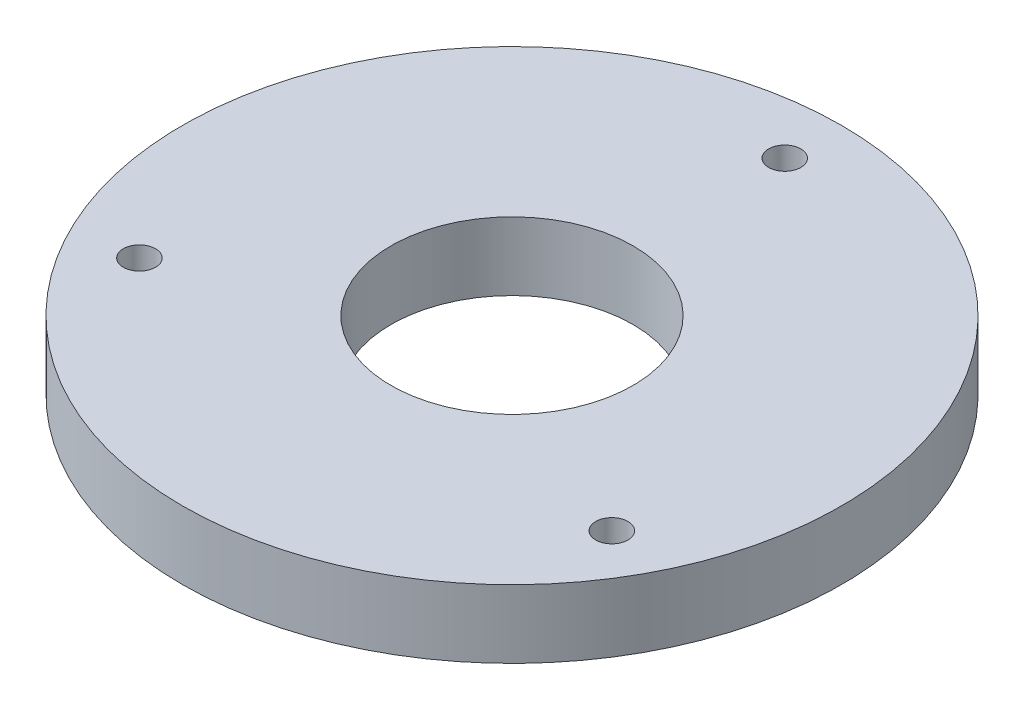
ISO-10303-21;
HEADER;
FILE_DESCRIPTION(('STEP AP214'),'2;1');
FILE_NAME('part.step','',(''),(''),'','','');
FILE_SCHEMA(('AUTOMOTIVE_DESIGN { 1 0 10303 214 1 1 1 1 }'));
ENDSEC;
DATA;
#1=APPLICATION_CONTEXT('core data for automotive mechanical design processes');
#2=APPLICATION_PROTOCOL_DEFINITION('international standard','automotive_design',2000,#1);
#3=PRODUCT_CONTEXT('',#1,'mechanical');
#4=PRODUCT('Part','Part','',(#3));
#5=PRODUCT_RELATED_PRODUCT_CATEGORY('part','',(#4));
#6=PRODUCT_DEFINITION_FORMATION('','',#4);
#7=PRODUCT_DEFINITION_CONTEXT('part definition',#1,'design');
#8=PRODUCT_DEFINITION('design','',#6,#7);
#9=PRODUCT_DEFINITION_SHAPE('','',#8);
#10=(LENGTH_UNIT() NAMED_UNIT(*) SI_UNIT(.MILLI.,.METRE.));
#11=(NAMED_UNIT(*) PLANE_ANGLE_UNIT() SI_UNIT($,.RADIAN.));
#12=(NAMED_UNIT(*) SI_UNIT($,.STERADIAN.) SOLID_ANGLE_UNIT());
#13=UNCERTAINTY_MEASURE_WITH_UNIT(LENGTH_MEASURE(1.E-05),#10,'distance_accuracy_value','');
#14=(GEOMETRIC_REPRESENTATION_CONTEXT(3) GLOBAL_UNCERTAINTY_ASSIGNED_CONTEXT((#13)) GLOBAL_UNIT_ASSIGNED_CONTEXT((#10,
#11,#12)) REPRESENTATION_CONTEXT('',''));
#15=CARTESIAN_POINT('',(0.,0.,0.));
#16=DIRECTION('',(0.,0.,1.));
#17=DIRECTION('',(1.,0.,0.));
#18=AXIS2_PLACEMENT_3D('',#15,#16,#17);
#19=CARTESIAN_POINT('',(0.,7.62,0.));
#20=DIRECTION('',(0.,1.,0.));
#21=DIRECTION('',(0.,0.,1.));
#22=AXIS2_PLACEMENT_3D('',#19,#20,#21);
#23=PLANE('',#22);
#24=CARTESIAN_POINT('',(0.,7.62,-30.48));
#25=DIRECTION('',(0.,1.,0.));
#26=DIRECTION('',(0.,0.,1.));
#27=AXIS2_PLACEMENT_3D('',#24,#25,#26);
#28=CIRCLE('',#27,1.8);
#29=CARTESIAN_POINT('',(0.,7.62,-28.68));
#30=VERTEX_POINT('',#29);
#31=EDGE_CURVE('E66',#30,#30,#28,.T.);
#32=ORIENTED_EDGE('',*,*,#31,.F.);
#33=EDGE_LOOP('',(#32));
#34=FACE_BOUND('',#33,.T.);
#35=CARTESIAN_POINT('',(26.3964543073516,7.62,15.2399999999989));
#36=DIRECTION('',(0.,1.,0.));
#37=DIRECTION('',(0.,0.,1.));
#38=AXIS2_PLACEMENT_3D('',#35,#36,#37);
#39=CIRCLE('',#38,1.8);
#40=CARTESIAN_POINT('',(26.3964543073516,7.62,17.0399999999989));
#41=VERTEX_POINT('',#40);
#42=EDGE_CURVE('E60',#41,#41,#39,.T.);
#43=ORIENTED_EDGE('',*,*,#42,.F.);
#44=EDGE_LOOP('',(#43));
#45=FACE_BOUND('',#44,.T.);
#46=CARTESIAN_POINT('',(-26.3964543073477,7.62,15.2400000000011));
#47=DIRECTION('',(0.,1.,0.));
#48=DIRECTION('',(0.,0.,1.));
#49=AXIS2_PLACEMENT_3D('',#46,#47,#48);
#50=CIRCLE('',#49,1.8);
#51=CARTESIAN_POINT('',(-26.3964543073477,7.62,17.0400000000011));
#52=VERTEX_POINT('',#51);
#53=EDGE_CURVE('E54',#52,#52,#50,.T.);
#54=ORIENTED_EDGE('',*,*,#53,.F.);
#55=EDGE_LOOP('',(#54));
#56=FACE_BOUND('',#55,.T.);
#57=CARTESIAN_POINT('',(0.,7.62,0.));
#58=DIRECTION('',(0.,1.,0.));
#59=DIRECTION('',(0.,0.,1.));
#60=AXIS2_PLACEMENT_3D('',#57,#58,#59);
#61=CIRCLE('',#60,36.83);
#62=CARTESIAN_POINT('',(0.,7.62,-36.83));
#63=VERTEX_POINT('',#62);
#64=EDGE_CURVE('E10',#63,#63,#61,.T.);
#65=ORIENTED_EDGE('',*,*,#64,.T.);
#66=EDGE_LOOP('',(#65));
#67=FACE_BOUND('',#66,.T.);
#68=CARTESIAN_POINT('',(0.,7.62,0.));
#69=DIRECTION('',(0.,1.,0.));
#70=DIRECTION('',(0.,0.,1.));
#71=AXIS2_PLACEMENT_3D('',#68,#69,#70);
#72=CIRCLE('',#71,13.5255);
#73=CARTESIAN_POINT('',(0.,7.62,-13.5255));
#74=VERTEX_POINT('',#73);
#75=EDGE_CURVE('E44',#74,#74,#72,.T.);
#76=ORIENTED_EDGE('',*,*,#75,.F.);
#77=EDGE_LOOP('',(#76));
#78=FACE_BOUND('',#77,.T.);
#79=ADVANCED_FACE('F33',(#34,#45,#56,#67,#78),#23,.T.);
#80=CARTESIAN_POINT('',(0.,0.,0.));
#81=DIRECTION('',(0.,1.,0.));
#82=DIRECTION('',(0.,0.,1.));
#83=AXIS2_PLACEMENT_3D('',#80,#81,#82);
#84=PLANE('',#83);
#85=CARTESIAN_POINT('',(0.,0.,-30.48));
#86=DIRECTION('',(0.,1.,0.));
#87=DIRECTION('',(0.,0.,1.));
#88=AXIS2_PLACEMENT_3D('',#85,#86,#87);
#89=CIRCLE('',#88,1.8);
#90=CARTESIAN_POINT('',(0.,0.,-28.68));
#91=VERTEX_POINT('',#90);
#92=EDGE_CURVE('E63',#91,#91,#89,.T.);
#93=ORIENTED_EDGE('',*,*,#92,.T.);
#94=EDGE_LOOP('',(#93));
#95=FACE_BOUND('',#94,.T.);
#96=CARTESIAN_POINT('',(26.3964543073516,0.,15.2399999999989));
#97=DIRECTION('',(0.,1.,0.));
#98=DIRECTION('',(0.,0.,1.));
#99=AXIS2_PLACEMENT_3D('',#96,#97,#98);
#100=CIRCLE('',#99,1.8);
#101=CARTESIAN_POINT('',(26.3964543073516,0.,17.0399999999989));
#102=VERTEX_POINT('',#101);
#103=EDGE_CURVE('E57',#102,#102,#100,.T.);
#104=ORIENTED_EDGE('',*,*,#103,.T.);
#105=EDGE_LOOP('',(#104));
#106=FACE_BOUND('',#105,.T.);
#107=CARTESIAN_POINT('',(-26.3964543073477,0.,15.2400000000011));
#108=DIRECTION('',(0.,1.,0.));
#109=DIRECTION('',(0.,0.,1.));
#110=AXIS2_PLACEMENT_3D('',#107,#108,#109);
#111=CIRCLE('',#110,1.8);
#112=CARTESIAN_POINT('',(-26.3964543073477,0.,17.0400000000011));
#113=VERTEX_POINT('',#112);
#114=EDGE_CURVE('E49',#113,#113,#111,.T.);
#115=ORIENTED_EDGE('',*,*,#114,.T.);
#116=EDGE_LOOP('',(#115));
#117=FACE_BOUND('',#116,.T.);
#118=CARTESIAN_POINT('',(0.,0.,0.));
#119=DIRECTION('',(0.,1.,0.));
#120=DIRECTION('',(0.,0.,1.));
#121=AXIS2_PLACEMENT_3D('',#118,#119,#120);
#122=CIRCLE('',#121,36.83);
#123=CARTESIAN_POINT('',(0.,0.,-36.83));
#124=VERTEX_POINT('',#123);
#125=EDGE_CURVE('E37',#124,#124,#122,.T.);
#126=ORIENTED_EDGE('',*,*,#125,.F.);
#127=EDGE_LOOP('',(#126));
#128=FACE_BOUND('',#127,.T.);
#129=CARTESIAN_POINT('',(0.,0.,0.));
#130=DIRECTION('',(0.,1.,0.));
#131=DIRECTION('',(0.,0.,1.));
#132=AXIS2_PLACEMENT_3D('',#129,#130,#131);
#133=CIRCLE('',#132,13.5255);
#134=CARTESIAN_POINT('',(0.,0.,-13.5255));
#135=VERTEX_POINT('',#134);
#136=EDGE_CURVE('E46',#135,#135,#133,.T.);
#137=ORIENTED_EDGE('',*,*,#136,.T.);
#138=EDGE_LOOP('',(#137));
#139=FACE_BOUND('',#138,.T.);
#140=ADVANCED_FACE('F74',(#95,#106,#117,#128,#139),#84,.F.);
#141=CARTESIAN_POINT('',(0.,7.62,0.));
#142=DIRECTION('',(0.,-1.,0.));
#143=DIRECTION('',(0.,0.,-1.));
#144=AXIS2_PLACEMENT_3D('',#141,#142,#143);
#145=CYLINDRICAL_SURFACE('',#144,36.83);
#146=CARTESIAN_POINT('',(0.,7.62,-36.83));
#147=CARTESIAN_POINT('',(0.,7.540625,-36.83));
#148=CARTESIAN_POINT('',(0.,7.46125,-36.83));
#149=CARTESIAN_POINT('',(0.,7.3025,-36.83));
#150=CARTESIAN_POINT('',(0.,7.223125,-36.83));
#151=CARTESIAN_POINT('',(0.,7.064375,-36.83));
#152=CARTESIAN_POINT('',(0.,6.985,-36.83));
#153=CARTESIAN_POINT('',(0.,6.82625,-36.83));
#154=CARTESIAN_POINT('',(0.,6.746875,-36.83));
#155=CARTESIAN_POINT('',(0.,6.588125,-36.83));
#156=CARTESIAN_POINT('',(0.,6.50875,-36.83));
#157=CARTESIAN_POINT('',(0.,6.35,-36.83));
#158=CARTESIAN_POINT('',(0.,6.270625,-36.83));
#159=CARTESIAN_POINT('',(0.,6.111875,-36.83));
#160=CARTESIAN_POINT('',(0.,6.0325,-36.83));
#161=CARTESIAN_POINT('',(0.,5.87375,-36.83));
#162=CARTESIAN_POINT('',(0.,5.794375,-36.83));
#163=CARTESIAN_POINT('',(0.,5.635625,-36.83));
#164=CARTESIAN_POINT('',(0.,5.55625,-36.83));
#165=CARTESIAN_POINT('',(0.,5.3975,-36.83));
#166=CARTESIAN_POINT('',(0.,5.318125,-36.83));
#167=CARTESIAN_POINT('',(0.,5.159375,-36.83));
#168=CARTESIAN_POINT('',(0.,5.08,-36.83));
#169=CARTESIAN_POINT('',(0.,4.92125,-36.83));
#170=CARTESIAN_POINT('',(0.,4.841875,-36.83));
#171=CARTESIAN_POINT('',(0.,4.683125,-36.83));
#172=CARTESIAN_POINT('',(0.,4.60375,-36.83));
#173=CARTESIAN_POINT('',(0.,4.445,-36.83));
#174=CARTESIAN_POINT('',(0.,4.365625,-36.83));
#175=CARTESIAN_POINT('',(0.,4.206875,-36.83));
#176=CARTESIAN_POINT('',(0.,4.1275,-36.83));
#177=CARTESIAN_POINT('',(0.,3.96875,-36.83));
#178=CARTESIAN_POINT('',(0.,3.889375,-36.83));
#179=CARTESIAN_POINT('',(0.,3.730625,-36.83));
#180=CARTESIAN_POINT('',(0.,3.65125,-36.83));
#181=CARTESIAN_POINT('',(0.,3.4925,-36.83));
#182=CARTESIAN_POINT('',(0.,3.413125,-36.83));
#183=CARTESIAN_POINT('',(0.,3.254375,-36.83));
#184=CARTESIAN_POINT('',(0.,3.175,-36.83));
#185=CARTESIAN_POINT('',(0.,3.01625,-36.83));
#186=CARTESIAN_POINT('',(0.,2.936875,-36.83));
#187=CARTESIAN_POINT('',(0.,2.778125,-36.83));
#188=CARTESIAN_POINT('',(0.,2.69875,-36.83));
#189=CARTESIAN_POINT('',(0.,2.54,-36.83));
#190=CARTESIAN_POINT('',(0.,2.460625,-36.83));
#191=CARTESIAN_POINT('',(0.,2.301875,-36.83));
#192=CARTESIAN_POINT('',(0.,2.2225,-36.83));
#193=CARTESIAN_POINT('',(0.,2.06375,-36.83));
#194=CARTESIAN_POINT('',(0.,1.984375,-36.83));
#195=CARTESIAN_POINT('',(0.,1.825625,-36.83));
#196=CARTESIAN_POINT('',(0.,1.74625,-36.83));
#197=CARTESIAN_POINT('',(0.,1.5875,-36.83));
#198=CARTESIAN_POINT('',(0.,1.508125,-36.83));
#199=CARTESIAN_POINT('',(0.,1.349375,-36.83));
#200=CARTESIAN_POINT('',(0.,1.27,-36.83));
#201=CARTESIAN_POINT('',(0.,1.11125,-36.83));
#202=CARTESIAN_POINT('',(0.,1.031875,-36.83));
#203=CARTESIAN_POINT('',(0.,0.873125,-36.83));
#204=CARTESIAN_POINT('',(0.,0.79375,-36.83));
#205=CARTESIAN_POINT('',(0.,0.635,-36.83));
#206=CARTESIAN_POINT('',(0.,0.555625,-36.83));
#207=CARTESIAN_POINT('',(0.,0.396875,-36.83));
#208=CARTESIAN_POINT('',(0.,0.3175,-36.83));
#209=CARTESIAN_POINT('',(0.,0.15875,-36.83));
#210=CARTESIAN_POINT('',(0.,0.0793749999999999,-36.83));
#211=CARTESIAN_POINT('',(0.,0.,-36.83));
#212=B_SPLINE_CURVE_WITH_KNOTS('',3,(#146,#147,#148,#149,#150,#151,#152,#153,#154,#155,#156,
#157,#158,#159,#160,#161,#162,#163,#164,#165,#166,#167,#168,#169,#170,#171,#172,#173,#174,#175,
#176,#177,#178,#179,#180,#181,#182,#183,#184,#185,#186,#187,#188,#189,#190,#191,#192,#193,#194,
#195,#196,#197,#198,#199,#200,#201,#202,#203,#204,#205,#206,#207,#208,#209,#210,#211),
.UNSPECIFIED.,.F.,.F.,(4,2,2,2,2,2,2,2,2,2,2,2,2,2,2,2,2,2,2,2,2,2,2,2,2,2,2,2,2,2,2,2,4),(0.,
0.238125,0.476249999999999,0.714375,0.952499999999999,1.190625,1.42875,1.666875,1.905,2.143125,
2.38125,2.619375,2.8575,3.095625,3.33375,3.571875,3.81,4.048125,4.28625,4.524375,4.7625,
5.000625,5.23875,5.476875,5.715,5.953125,6.19125,6.429375,6.6675,6.905625,7.14375,7.381875,
7.62),.UNSPECIFIED.);
#213=EDGE_CURVE('BSEAM35',#63,#124,#212,.T.);
#214=ORIENTED_EDGE('',*,*,#64,.F.);
#215=ORIENTED_EDGE('',*,*,#125,.T.);
#216=ORIENTED_EDGE('',*,*,#213,.T.);
#217=ORIENTED_EDGE('',*,*,#213,.F.);
#218=EDGE_LOOP('',(#214,#216,#215,#217));
#219=FACE_BOUND('',#218,.T.);
#220=ADVANCED_FACE('F35',(#219),#145,.T.);
#221=CARTESIAN_POINT('',(0.,7.62,0.));
#222=DIRECTION('',(0.,-1.,0.));
#223=DIRECTION('',(0.,0.,-1.));
#224=AXIS2_PLACEMENT_3D('',#221,#222,#223);
#225=CYLINDRICAL_SURFACE('',#224,13.5255);
#226=CARTESIAN_POINT('',(0.,7.62,-13.5255));
#227=CARTESIAN_POINT('',(0.,7.540625,-13.5255));
#228=CARTESIAN_POINT('',(0.,7.46125,-13.5255));
#229=CARTESIAN_POINT('',(0.,7.3025,-13.5255));
#230=CARTESIAN_POINT('',(0.,7.223125,-13.5255));
#231=CARTESIAN_POINT('',(0.,7.064375,-13.5255));
#232=CARTESIAN_POINT('',(0.,6.985,-13.5255));
#233=CARTESIAN_POINT('',(0.,6.82625,-13.5255));
#234=CARTESIAN_POINT('',(0.,6.746875,-13.5255));
#235=CARTESIAN_POINT('',(0.,6.588125,-13.5255));
#236=CARTESIAN_POINT('',(0.,6.50875,-13.5255));
#237=CARTESIAN_POINT('',(0.,6.35,-13.5255));
#238=CARTESIAN_POINT('',(0.,6.270625,-13.5255));
#239=CARTESIAN_POINT('',(0.,6.111875,-13.5255));
#240=CARTESIAN_POINT('',(0.,6.0325,-13.5255));
#241=CARTESIAN_POINT('',(0.,5.87375,-13.5255));
#242=CARTESIAN_POINT('',(0.,5.794375,-13.5255));
#243=CARTESIAN_POINT('',(0.,5.635625,-13.5255));
#244=CARTESIAN_POINT('',(0.,5.55625,-13.5255));
#245=CARTESIAN_POINT('',(0.,5.3975,-13.5255));
#246=CARTESIAN_POINT('',(0.,5.318125,-13.5255));
#247=CARTESIAN_POINT('',(0.,5.159375,-13.5255));
#248=CARTESIAN_POINT('',(0.,5.08,-13.5255));
#249=CARTESIAN_POINT('',(0.,4.92125,-13.5255));
#250=CARTESIAN_POINT('',(0.,4.841875,-13.5255));
#251=CARTESIAN_POINT('',(0.,4.683125,-13.5255));
#252=CARTESIAN_POINT('',(0.,4.60375,-13.5255));
#253=CARTESIAN_POINT('',(0.,4.445,-13.5255));
#254=CARTESIAN_POINT('',(0.,4.365625,-13.5255));
#255=CARTESIAN_POINT('',(0.,4.206875,-13.5255));
#256=CARTESIAN_POINT('',(0.,4.1275,-13.5255));
#257=CARTESIAN_POINT('',(0.,3.96875,-13.5255));
#258=CARTESIAN_POINT('',(0.,3.889375,-13.5255));
#259=CARTESIAN_POINT('',(0.,3.730625,-13.5255));
#260=CARTESIAN_POINT('',(0.,3.65125,-13.5255));
#261=CARTESIAN_POINT('',(0.,3.4925,-13.5255));
#262=CARTESIAN_POINT('',(0.,3.413125,-13.5255));
#263=CARTESIAN_POINT('',(0.,3.254375,-13.5255));
#264=CARTESIAN_POINT('',(0.,3.175,-13.5255));
#265=CARTESIAN_POINT('',(0.,3.01625,-13.5255));
#266=CARTESIAN_POINT('',(0.,2.936875,-13.5255));
#267=CARTESIAN_POINT('',(0.,2.778125,-13.5255));
#268=CARTESIAN_POINT('',(0.,2.69875,-13.5255));
#269=CARTESIAN_POINT('',(0.,2.54,-13.5255));
#270=CARTESIAN_POINT('',(0.,2.460625,-13.5255));
#271=CARTESIAN_POINT('',(0.,2.301875,-13.5255));
#272=CARTESIAN_POINT('',(0.,2.2225,-13.5255));
#273=CARTESIAN_POINT('',(0.,2.06375,-13.5255));
#274=CARTESIAN_POINT('',(0.,1.984375,-13.5255));
#275=CARTESIAN_POINT('',(0.,1.825625,-13.5255));
#276=CARTESIAN_POINT('',(0.,1.74625,-13.5255));
#277=CARTESIAN_POINT('',(0.,1.5875,-13.5255));
#278=CARTESIAN_POINT('',(0.,1.508125,-13.5255));
#279=CARTESIAN_POINT('',(0.,1.349375,-13.5255));
#280=CARTESIAN_POINT('',(0.,1.27,-13.5255));
#281=CARTESIAN_POINT('',(0.,1.11125,-13.5255));
#282=CARTESIAN_POINT('',(0.,1.031875,-13.5255));
#283=CARTESIAN_POINT('',(0.,0.873125,-13.5255));
#284=CARTESIAN_POINT('',(0.,0.79375,-13.5255));
#285=CARTESIAN_POINT('',(0.,0.635,-13.5255));
#286=CARTESIAN_POINT('',(0.,0.555625,-13.5255));
#287=CARTESIAN_POINT('',(0.,0.396875,-13.5255));
#288=CARTESIAN_POINT('',(0.,0.3175,-13.5255));
#289=CARTESIAN_POINT('',(0.,0.15875,-13.5255));
#290=CARTESIAN_POINT('',(0.,0.0793749999999999,-13.5255));
#291=CARTESIAN_POINT('',(0.,0.,-13.5255));
#292=B_SPLINE_CURVE_WITH_KNOTS('',3,(#226,#227,#228,#229,#230,#231,#232,#233,#234,#235,#236,
#237,#238,#239,#240,#241,#242,#243,#244,#245,#246,#247,#248,#249,#250,#251,#252,#253,#254,#255,
#256,#257,#258,#259,#260,#261,#262,#263,#264,#265,#266,#267,#268,#269,#270,#271,#272,#273,#274,
#275,#276,#277,#278,#279,#280,#281,#282,#283,#284,#285,#286,#287,#288,#289,#290,#291),
.UNSPECIFIED.,.F.,.F.,(4,2,2,2,2,2,2,2,2,2,2,2,2,2,2,2,2,2,2,2,2,2,2,2,2,2,2,2,2,2,2,2,4),(0.,
0.238125,0.476249999999999,0.714375,0.952499999999999,1.190625,1.42875,1.666875,1.905,2.143125,
2.38125,2.619375,2.8575,3.095625,3.33375,3.571875,3.81,4.048125,4.28625,4.524375,4.7625,
5.000625,5.23875,5.476875,5.715,5.953125,6.19125,6.429375,6.6675,6.905625,7.14375,7.381875,
7.62),.UNSPECIFIED.);
#293=EDGE_CURVE('BSEAM82',#74,#135,#292,.T.);
#294=ORIENTED_EDGE('',*,*,#75,.T.);
#295=ORIENTED_EDGE('',*,*,#136,.F.);
#296=ORIENTED_EDGE('',*,*,#293,.T.);
#297=ORIENTED_EDGE('',*,*,#293,.F.);
#298=EDGE_LOOP('',(#294,#296,#295,#297));
#299=FACE_BOUND('',#298,.T.);
#300=ADVANCED_FACE('F82',(#299),#225,.F.);
#301=CARTESIAN_POINT('',(-26.3964543073477,7.62,15.2400000000011));
#302=DIRECTION('',(0.,1.,0.));
#303=DIRECTION('',(0.,0.,1.));
#304=AXIS2_PLACEMENT_3D('',#301,#302,#303);
#305=CYLINDRICAL_SURFACE('',#304,1.8);
#306=ORIENTED_EDGE('',*,*,#114,.F.);
#307=EDGE_LOOP('',(#306));
#308=FACE_BOUND('',#307,.T.);
#309=ORIENTED_EDGE('',*,*,#53,.T.);
#310=EDGE_LOOP('',(#309));
#311=FACE_BOUND('',#310,.T.);
#312=ADVANCED_FACE('F85',(#308,#311),#305,.F.);
#313=CARTESIAN_POINT('',(26.3964543073516,7.62,15.2399999999989));
#314=DIRECTION('',(0.,1.,0.));
#315=DIRECTION('',(0.,0.,1.));
#316=AXIS2_PLACEMENT_3D('',#313,#314,#315);
#317=CYLINDRICAL_SURFACE('',#316,1.8);
#318=ORIENTED_EDGE('',*,*,#103,.F.);
#319=EDGE_LOOP('',(#318));
#320=FACE_BOUND('',#319,.T.);
#321=ORIENTED_EDGE('',*,*,#42,.T.);
#322=EDGE_LOOP('',(#321));
#323=FACE_BOUND('',#322,.T.);
#324=ADVANCED_FACE('F99',(#320,#323),#317,.F.);
#325=CARTESIAN_POINT('',(0.,7.62,-30.48));
#326=DIRECTION('',(0.,1.,0.));
#327=DIRECTION('',(0.,0.,1.));
#328=AXIS2_PLACEMENT_3D('',#325,#326,#327);
#329=CYLINDRICAL_SURFACE('',#328,1.8);
#330=ORIENTED_EDGE('',*,*,#92,.F.);
#331=EDGE_LOOP('',(#330));
#332=FACE_BOUND('',#331,.T.);
#333=ORIENTED_EDGE('',*,*,#31,.T.);
#334=EDGE_LOOP('',(#333));
#335=FACE_BOUND('',#334,.T.);
#336=ADVANCED_FACE('F70',(#332,#335),#329,.F.);
#337=CLOSED_SHELL('',(#79,#140,#220,#300,#312,#324,#336));
#338=MANIFOLD_SOLID_BREP('B2',#337);
#339=ADVANCED_BREP_SHAPE_REPRESENTATION('',(#18,#338),#14);
#340=SHAPE_DEFINITION_REPRESENTATION(#9,#339);
ENDSEC;
END-ISO-10303-21;
